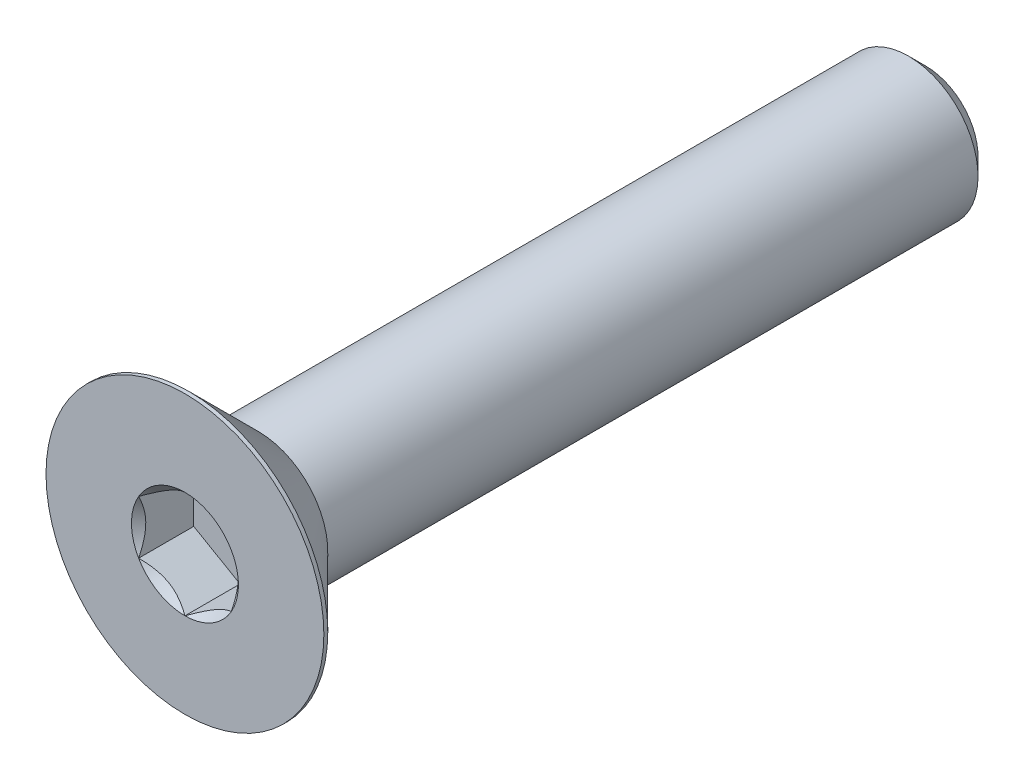
ISO-10303-21;
HEADER;
FILE_DESCRIPTION(('STEP AP214'),'2;1');
FILE_NAME('part.step','',(''),(''),'','','');
FILE_SCHEMA(('AUTOMOTIVE_DESIGN { 1 0 10303 214 1 1 1 1 }'));
ENDSEC;
DATA;
#1=APPLICATION_CONTEXT('core data for automotive mechanical design processes');
#2=APPLICATION_PROTOCOL_DEFINITION('international standard','automotive_design',2000,#1);
#3=PRODUCT_CONTEXT('',#1,'mechanical');
#4=PRODUCT('Part','Part','',(#3));
#5=PRODUCT_RELATED_PRODUCT_CATEGORY('part','',(#4));
#6=PRODUCT_DEFINITION_FORMATION('','',#4);
#7=PRODUCT_DEFINITION_CONTEXT('part definition',#1,'design');
#8=PRODUCT_DEFINITION('design','',#6,#7);
#9=PRODUCT_DEFINITION_SHAPE('','',#8);
#10=(LENGTH_UNIT() NAMED_UNIT(*) SI_UNIT(.MILLI.,.METRE.));
#11=(NAMED_UNIT(*) PLANE_ANGLE_UNIT() SI_UNIT($,.RADIAN.));
#12=(NAMED_UNIT(*) SI_UNIT($,.STERADIAN.) SOLID_ANGLE_UNIT());
#13=UNCERTAINTY_MEASURE_WITH_UNIT(LENGTH_MEASURE(1.E-05),#10,'distance_accuracy_value','');
#14=(GEOMETRIC_REPRESENTATION_CONTEXT(3) GLOBAL_UNCERTAINTY_ASSIGNED_CONTEXT((#13)) GLOBAL_UNIT_ASSIGNED_CONTEXT((#10,
#11,#12)) REPRESENTATION_CONTEXT('',''));
#15=CARTESIAN_POINT('',(0.,0.,0.));
#16=DIRECTION('',(0.,0.,1.));
#17=DIRECTION('',(1.,0.,0.));
#18=AXIS2_PLACEMENT_3D('',#15,#16,#17);
#19=CARTESIAN_POINT('',(0.,-1.5,-8.));
#20=DIRECTION('',(0.,0.,1.));
#21=DIRECTION('',(0.,-1.,0.));
#22=AXIS2_PLACEMENT_3D('',#19,#20,#21);
#23=PLANE('',#22);
#24=CARTESIAN_POINT('',(0.,0.,-8.));
#25=DIRECTION('',(0.,0.,-1.));
#26=DIRECTION('',(0.,-1.,0.));
#27=AXIS2_PLACEMENT_3D('',#24,#25,#26);
#28=CIRCLE('',#27,1.125);
#29=CARTESIAN_POINT('',(0.,1.125,-8.));
#30=VERTEX_POINT('',#29);
#31=EDGE_CURVE('E25',#30,#30,#28,.T.);
#32=ORIENTED_EDGE('',*,*,#31,.T.);
#33=EDGE_LOOP('',(#32));
#34=FACE_BOUND('',#33,.T.);
#35=ADVANCED_FACE('F17',(#34),#23,.F.);
#36=CARTESIAN_POINT('',(0.,-1.5,6.81));
#37=DIRECTION('',(0.,0.,-1.));
#38=DIRECTION('',(0.,-1.,0.));
#39=AXIS2_PLACEMENT_3D('',#36,#37,#38);
#40=PLANE('',#39);
#41=DIRECTION('',(0.,1.,0.));
#42=VECTOR('',#41,1.);
#43=CARTESIAN_POINT('',(1.,-1.03867513459482,6.81));
#44=LINE('',#43,#42);
#45=CARTESIAN_POINT('',(1.,-0.577350269189623,6.81));
#46=VERTEX_POINT('',#45);
#47=CARTESIAN_POINT('',(1.,0.577350269189626,6.81));
#48=VERTEX_POINT('',#47);
#49=EDGE_CURVE('E350',#46,#48,#44,.T.);
#50=ORIENTED_EDGE('',*,*,#49,.T.);
#51=DIRECTION('',(-0.866025403784439,0.5,0.));
#52=VECTOR('',#51,1.);
#53=CARTESIAN_POINT('',(1.07475952641917,0.534187836487029,6.81));
#54=LINE('',#53,#52);
#55=CARTESIAN_POINT('',(0.,1.15470053837925,6.81));
#56=VERTEX_POINT('',#55);
#57=EDGE_CURVE('E357',#48,#56,#54,.T.);
#58=ORIENTED_EDGE('',*,*,#57,.T.);
#59=DIRECTION('',(-0.866025403784439,-0.5,0.));
#60=VECTOR('',#59,1.);
#61=CARTESIAN_POINT('',(-0.574759526419163,0.822862971081845,6.81));
#62=LINE('',#61,#60);
#63=CARTESIAN_POINT('',(-1.,0.577350269189626,6.81));
#64=VERTEX_POINT('',#63);
#65=EDGE_CURVE('E118',#56,#64,#62,.T.);
#66=ORIENTED_EDGE('',*,*,#65,.T.);
#67=DIRECTION('',(0.,-1.,0.));
#68=VECTOR('',#67,1.);
#69=CARTESIAN_POINT('',(-1.,-0.461324865405193,6.81));
#70=LINE('',#69,#68);
#71=CARTESIAN_POINT('',(-1.,-0.577350269189624,6.81));
#72=VERTEX_POINT('',#71);
#73=EDGE_CURVE('E114',#64,#72,#70,.T.);
#74=ORIENTED_EDGE('',*,*,#73,.T.);
#75=DIRECTION('',(0.866025403784439,-0.5,0.));
#76=VECTOR('',#75,1.);
#77=CARTESIAN_POINT('',(-0.425240473580827,-0.909187836487034,6.81));
#78=LINE('',#77,#76);
#79=CARTESIAN_POINT('',(0.,-1.15470053837925,6.81));
#80=VERTEX_POINT('',#79);
#81=EDGE_CURVE('E101',#72,#80,#78,.T.);
#82=ORIENTED_EDGE('',*,*,#81,.T.);
#83=DIRECTION('',(0.866025403784439,0.5,0.));
#84=VECTOR('',#83,1.);
#85=CARTESIAN_POINT('',(-0.0747595264191642,-1.19786297108184,6.81));
#86=LINE('',#85,#84);
#87=EDGE_CURVE('E111',#80,#46,#86,.T.);
#88=ORIENTED_EDGE('',*,*,#87,.T.);
#89=EDGE_LOOP('',(#50,#58,#66,#74,#82,#88));
#90=FACE_BOUND('',#89,.T.);
#91=ADVANCED_FACE('F116',(#90),#40,.F.);
#92=CARTESIAN_POINT('',(0.,0.,6.81));
#93=DIRECTION('',(0.,0.,1.));
#94=DIRECTION('',(0.,-1.,0.));
#95=AXIS2_PLACEMENT_3D('',#92,#93,#94);
#96=CYLINDRICAL_SURFACE('',#95,1.5);
#97=CARTESIAN_POINT('',(0.,0.,6.415));
#98=DIRECTION('',(0.,0.,-1.));
#99=DIRECTION('',(0.,-1.,0.));
#100=AXIS2_PLACEMENT_3D('',#97,#98,#99);
#101=CIRCLE('',#100,1.5);
#102=CARTESIAN_POINT('',(0.,1.5,6.415));
#103=VERTEX_POINT('',#102);
#104=EDGE_CURVE('E335',#103,#103,#101,.T.);
#105=ORIENTED_EDGE('',*,*,#104,.T.);
#106=DIRECTION('',(0.,0.,-1.));
#107=VECTOR('',#106,1.);
#108=CARTESIAN_POINT('',(0.,1.5,6.81));
#109=LINE('',#108,#107);
#110=CARTESIAN_POINT('',(0.,1.5,-7.625));
#111=VERTEX_POINT('',#110);
#112=EDGE_CURVE('E11',#103,#111,#109,.T.);
#113=ORIENTED_EDGE('',*,*,#112,.T.);
#114=CARTESIAN_POINT('',(0.,0.,-7.625));
#115=DIRECTION('',(0.,0.,1.));
#116=DIRECTION('',(0.,-1.,0.));
#117=AXIS2_PLACEMENT_3D('',#114,#115,#116);
#118=CIRCLE('',#117,1.5);
#119=EDGE_CURVE('E139',#111,#111,#118,.T.);
#120=ORIENTED_EDGE('',*,*,#119,.T.);
#121=ORIENTED_EDGE('',*,*,#112,.F.);
#122=EDGE_LOOP('',(#105,#113,#120,#121));
#123=FACE_BOUND('',#122,.T.);
#124=ADVANCED_FACE('F213',(#123),#96,.T.);
#125=CARTESIAN_POINT('',(0.,0.,-7.625));
#126=DIRECTION('',(0.,0.,1.));
#127=DIRECTION('',(0.,-1.,0.));
#128=AXIS2_PLACEMENT_3D('',#125,#126,#127);
#129=CONICAL_SURFACE('',#128,1.5,0.785398163397452);
#130=ORIENTED_EDGE('',*,*,#119,.F.);
#131=DIRECTION('',(0.,-0.70710678118655,-0.707106781186545));
#132=VECTOR('',#131,1.);
#133=CARTESIAN_POINT('',(0.,1.5,-7.625));
#134=LINE('',#133,#132);
#135=EDGE_CURVE('E140',#111,#30,#134,.T.);
#136=ORIENTED_EDGE('',*,*,#135,.T.);
#137=ORIENTED_EDGE('',*,*,#31,.F.);
#138=ORIENTED_EDGE('',*,*,#135,.F.);
#139=EDGE_LOOP('',(#130,#136,#137,#138));
#140=FACE_BOUND('',#139,.T.);
#141=ADVANCED_FACE('F192',(#140),#129,.T.);
#142=CARTESIAN_POINT('',(0.,-1.15470053837925,6.81));
#143=DIRECTION('',(0.5,-0.866025403784439,0.));
#144=DIRECTION('',(0.,0.,-1.));
#145=AXIS2_PLACEMENT_3D('',#142,#143,#144);
#146=PLANE('',#145);
#147=CARTESIAN_POINT('',(0.999999999999948,-0.577350269189652,7.99999999999997));
#148=CARTESIAN_POINT('',(0.499999999999998,-0.866025403784436,7.71132486540521));
#149=CARTESIAN_POINT('',(0.,-1.15470053837922,7.99999999999997));
#150=(BOUNDED_CURVE() B_SPLINE_CURVE(2,(#147,#148,#149),.UNSPECIFIED.,.F.,
.F.) B_SPLINE_CURVE_WITH_KNOTS((3,3),(0.124274873543865,0.3218671551163),
.UNSPECIFIED.) CURVE() GEOMETRIC_REPRESENTATION_ITEM() RATIONAL_B_SPLINE_CURVE((1.46410161513778,
1.69059892324149,1.46410161513778)) REPRESENTATION_ITEM(''));
#151=CARTESIAN_POINT('',(1.,-0.577350269189624,8.));
#152=VERTEX_POINT('',#151);
#153=CARTESIAN_POINT('',(0.,-1.15470053837925,8.));
#154=VERTEX_POINT('',#153);
#155=EDGE_CURVE('E344',#152,#154,#150,.T.);
#156=ORIENTED_EDGE('',*,*,#155,.F.);
#157=DIRECTION('',(0.,0.,1.));
#158=VECTOR('',#157,1.);
#159=CARTESIAN_POINT('',(1.,-0.577350269189623,6.81));
#160=LINE('',#159,#158);
#161=EDGE_CURVE('E353',#46,#152,#160,.T.);
#162=ORIENTED_EDGE('',*,*,#161,.F.);
#163=ORIENTED_EDGE('',*,*,#87,.F.);
#164=DIRECTION('',(0.,0.,1.));
#165=VECTOR('',#164,1.);
#166=CARTESIAN_POINT('',(0.,-1.15470053837925,6.81));
#167=LINE('',#166,#165);
#168=EDGE_CURVE('E108',#80,#154,#167,.T.);
#169=ORIENTED_EDGE('',*,*,#168,.T.);
#170=EDGE_LOOP('',(#156,#162,#163,#169));
#171=FACE_BOUND('',#170,.T.);
#172=ADVANCED_FACE('F187',(#171),#146,.F.);
#173=CARTESIAN_POINT('',(-1.,-0.577350269189624,6.81));
#174=DIRECTION('',(-0.5,-0.866025403784439,0.));
#175=DIRECTION('',(-0.866025403784439,0.5,0.));
#176=AXIS2_PLACEMENT_3D('',#173,#174,#175);
#177=PLANE('',#176);
#178=CARTESIAN_POINT('',(0.,-1.15470053837922,7.99999999999997));
#179=CARTESIAN_POINT('',(-0.499999999999999,-0.866025403784436,7.71132486540521));
#180=CARTESIAN_POINT('',(-0.999999999999948,-0.577350269189652,7.99999999999997));
#181=(BOUNDED_CURVE() B_SPLINE_CURVE(2,(#178,#179,#180),.UNSPECIFIED.,.F.,
.F.) B_SPLINE_CURVE_WITH_KNOTS((3,3),(0.124274873543865,0.321867155116299),
.UNSPECIFIED.) CURVE() GEOMETRIC_REPRESENTATION_ITEM() RATIONAL_B_SPLINE_CURVE((1.46410161513778,
1.69059892324148,1.46410161513777)) REPRESENTATION_ITEM(''));
#182=CARTESIAN_POINT('',(-1.,-0.577350269189624,8.));
#183=VERTEX_POINT('',#182);
#184=EDGE_CURVE('E404',#154,#183,#181,.T.);
#185=ORIENTED_EDGE('',*,*,#184,.F.);
#186=ORIENTED_EDGE('',*,*,#168,.F.);
#187=ORIENTED_EDGE('',*,*,#81,.F.);
#188=DIRECTION('',(0.,0.,1.));
#189=VECTOR('',#188,1.);
#190=CARTESIAN_POINT('',(-1.,-0.577350269189624,6.81));
#191=LINE('',#190,#189);
#192=EDGE_CURVE('E106',#72,#183,#191,.T.);
#193=ORIENTED_EDGE('',*,*,#192,.T.);
#194=EDGE_LOOP('',(#185,#186,#187,#193));
#195=FACE_BOUND('',#194,.T.);
#196=ADVANCED_FACE('F104',(#195),#177,.F.);
#197=CARTESIAN_POINT('',(-1.,0.577350269189626,6.81));
#198=DIRECTION('',(-1.,0.,0.));
#199=DIRECTION('',(0.,0.,1.));
#200=AXIS2_PLACEMENT_3D('',#197,#198,#199);
#201=PLANE('',#200);
#202=CARTESIAN_POINT('',(-0.999999999999997,-0.577350269189565,7.99999999999997));
#203=CARTESIAN_POINT('',(-0.999999999999997,0.,7.71132486540521));
#204=CARTESIAN_POINT('',(-0.999999999999997,0.577350269189568,7.99999999999997));
#205=(BOUNDED_CURVE() B_SPLINE_CURVE(2,(#202,#203,#204),.UNSPECIFIED.,.F.,
.F.) B_SPLINE_CURVE_WITH_KNOTS((3,3),(0.124274873543866,0.321867155116299),
.UNSPECIFIED.) CURVE() GEOMETRIC_REPRESENTATION_ITEM() RATIONAL_B_SPLINE_CURVE((1.46410161513778,
1.69059892324148,1.46410161513778)) REPRESENTATION_ITEM(''));
#206=CARTESIAN_POINT('',(-1.,0.577350269189626,8.));
#207=VERTEX_POINT('',#206);
#208=EDGE_CURVE('E126',#183,#207,#205,.T.);
#209=ORIENTED_EDGE('',*,*,#208,.F.);
#210=ORIENTED_EDGE('',*,*,#192,.F.);
#211=ORIENTED_EDGE('',*,*,#73,.F.);
#212=DIRECTION('',(0.,0.,1.));
#213=VECTOR('',#212,1.);
#214=CARTESIAN_POINT('',(-1.,0.577350269189626,6.81));
#215=LINE('',#214,#213);
#216=EDGE_CURVE('E131',#64,#207,#215,.T.);
#217=ORIENTED_EDGE('',*,*,#216,.T.);
#218=EDGE_LOOP('',(#209,#210,#211,#217));
#219=FACE_BOUND('',#218,.T.);
#220=ADVANCED_FACE('F124',(#219),#201,.F.);
#221=CARTESIAN_POINT('',(0.,1.15470053837925,6.81));
#222=DIRECTION('',(-0.5,0.866025403784439,0.));
#223=DIRECTION('',(0.,0.,1.));
#224=AXIS2_PLACEMENT_3D('',#221,#222,#223);
#225=PLANE('',#224);
#226=CARTESIAN_POINT('',(-0.999999999999948,0.577350269189654,7.99999999999997));
#227=CARTESIAN_POINT('',(-0.499999999999999,0.866025403784439,7.71132486540521));
#228=CARTESIAN_POINT('',(0.,1.15470053837922,7.99999999999997));
#229=(BOUNDED_CURVE() B_SPLINE_CURVE(2,(#226,#227,#228),.UNSPECIFIED.,.F.,
.F.) B_SPLINE_CURVE_WITH_KNOTS((3,3),(0.124274873543865,0.321867155116299),
.UNSPECIFIED.) CURVE() GEOMETRIC_REPRESENTATION_ITEM() RATIONAL_B_SPLINE_CURVE((1.46410161513778,
1.69059892324148,1.46410161513778)) REPRESENTATION_ITEM(''));
#230=CARTESIAN_POINT('',(0.,1.15470053837925,8.));
#231=VERTEX_POINT('',#230);
#232=EDGE_CURVE('E396',#207,#231,#229,.T.);
#233=ORIENTED_EDGE('',*,*,#232,.F.);
#234=ORIENTED_EDGE('',*,*,#216,.F.);
#235=ORIENTED_EDGE('',*,*,#65,.F.);
#236=DIRECTION('',(0.,0.,1.));
#237=VECTOR('',#236,1.);
#238=CARTESIAN_POINT('',(0.,1.15470053837925,6.81));
#239=LINE('',#238,#237);
#240=EDGE_CURVE('E355',#56,#231,#239,.T.);
#241=ORIENTED_EDGE('',*,*,#240,.T.);
#242=EDGE_LOOP('',(#233,#234,#235,#241));
#243=FACE_BOUND('',#242,.T.);
#244=ADVANCED_FACE('F156',(#243),#225,.F.);
#245=CARTESIAN_POINT('',(1.,0.577350269189626,6.81));
#246=DIRECTION('',(0.5,0.866025403784439,0.));
#247=DIRECTION('',(0.,0.,-1.));
#248=AXIS2_PLACEMENT_3D('',#245,#246,#247);
#249=PLANE('',#248);
#250=CARTESIAN_POINT('',(0.,1.15470053837922,7.99999999999997));
#251=CARTESIAN_POINT('',(0.499999999999998,0.866025403784439,7.71132486540521));
#252=CARTESIAN_POINT('',(0.999999999999944,0.577350269189658,7.99999999999997));
#253=(BOUNDED_CURVE() B_SPLINE_CURVE(2,(#250,#251,#252),.UNSPECIFIED.,.F.,
.F.) B_SPLINE_CURVE_WITH_KNOTS((3,3),(0.124274873543865,0.321867155116298),
.UNSPECIFIED.) CURVE() GEOMETRIC_REPRESENTATION_ITEM() RATIONAL_B_SPLINE_CURVE((1.46410161513778,
1.69059892324148,1.46410161513778)) REPRESENTATION_ITEM(''));
#254=CARTESIAN_POINT('',(1.,0.577350269189626,8.));
#255=VERTEX_POINT('',#254);
#256=EDGE_CURVE('E386',#231,#255,#253,.T.);
#257=ORIENTED_EDGE('',*,*,#256,.F.);
#258=ORIENTED_EDGE('',*,*,#240,.F.);
#259=ORIENTED_EDGE('',*,*,#57,.F.);
#260=DIRECTION('',(0.,0.,1.));
#261=VECTOR('',#260,1.);
#262=CARTESIAN_POINT('',(1.,0.577350269189626,6.81));
#263=LINE('',#262,#261);
#264=EDGE_CURVE('E348',#48,#255,#263,.T.);
#265=ORIENTED_EDGE('',*,*,#264,.T.);
#266=EDGE_LOOP('',(#257,#258,#259,#265));
#267=FACE_BOUND('',#266,.T.);
#268=ADVANCED_FACE('F150',(#267),#249,.F.);
#269=CARTESIAN_POINT('',(1.,-0.577350269189623,6.81));
#270=DIRECTION('',(1.,0.,0.));
#271=DIRECTION('',(0.,-1.,0.));
#272=AXIS2_PLACEMENT_3D('',#269,#270,#271);
#273=PLANE('',#272);
#274=CARTESIAN_POINT('',(1.,0.577350269189568,7.99999999999997));
#275=CARTESIAN_POINT('',(1.,0.,7.71132486540521));
#276=CARTESIAN_POINT('',(1.,-0.577350269189565,7.99999999999997));
#277=(BOUNDED_CURVE() B_SPLINE_CURVE(2,(#274,#275,#276),.UNSPECIFIED.,.F.,
.F.) B_SPLINE_CURVE_WITH_KNOTS((3,3),(0.124274873543865,0.321867155116299),
.UNSPECIFIED.) CURVE() GEOMETRIC_REPRESENTATION_ITEM() RATIONAL_B_SPLINE_CURVE((1.46410161513777,
1.69059892324148,1.46410161513778)) REPRESENTATION_ITEM(''));
#278=EDGE_CURVE('E380',#255,#152,#277,.T.);
#279=ORIENTED_EDGE('',*,*,#278,.F.);
#280=ORIENTED_EDGE('',*,*,#264,.F.);
#281=ORIENTED_EDGE('',*,*,#49,.F.);
#282=ORIENTED_EDGE('',*,*,#161,.T.);
#283=EDGE_LOOP('',(#279,#280,#281,#282));
#284=FACE_BOUND('',#283,.T.);
#285=ADVANCED_FACE('F155',(#284),#273,.F.);
#286=CARTESIAN_POINT('',(0.,0.,8.));
#287=DIRECTION('',(0.,0.,1.));
#288=DIRECTION('',(-1.,0.,0.));
#289=AXIS2_PLACEMENT_3D('',#286,#287,#288);
#290=CONICAL_SURFACE('',#289,1.15470053837925,0.78539816339745);
#291=ORIENTED_EDGE('',*,*,#155,.T.);
#292=CARTESIAN_POINT('',(0.,0.,8.));
#293=DIRECTION('',(0.,0.,-1.));
#294=DIRECTION('',(-1.,0.,0.));
#295=AXIS2_PLACEMENT_3D('',#292,#293,#294);
#296=CIRCLE('',#295,1.15470053837925);
#297=EDGE_CURVE('E422',#152,#154,#296,.T.);
#298=ORIENTED_EDGE('',*,*,#297,.F.);
#299=EDGE_LOOP('',(#291,#298));
#300=FACE_BOUND('',#299,.T.);
#301=ADVANCED_FACE('F236',(#300),#290,.F.);
#302=CARTESIAN_POINT('',(0.,0.,8.));
#303=DIRECTION('',(0.,0.,1.));
#304=DIRECTION('',(-1.,0.,0.));
#305=AXIS2_PLACEMENT_3D('',#302,#303,#304);
#306=CONICAL_SURFACE('',#305,1.15470053837925,0.78539816339745);
#307=ORIENTED_EDGE('',*,*,#184,.T.);
#308=CARTESIAN_POINT('',(0.,0.,8.));
#309=DIRECTION('',(0.,0.,-1.));
#310=DIRECTION('',(-1.,0.,0.));
#311=AXIS2_PLACEMENT_3D('',#308,#309,#310);
#312=CIRCLE('',#311,1.15470053837925);
#313=EDGE_CURVE('E387',#154,#183,#312,.T.);
#314=ORIENTED_EDGE('',*,*,#313,.F.);
#315=EDGE_LOOP('',(#307,#314));
#316=FACE_BOUND('',#315,.T.);
#317=ADVANCED_FACE('F230',(#316),#306,.F.);
#318=CARTESIAN_POINT('',(0.,0.,8.));
#319=DIRECTION('',(0.,0.,1.));
#320=DIRECTION('',(-1.,0.,0.));
#321=AXIS2_PLACEMENT_3D('',#318,#319,#320);
#322=CONICAL_SURFACE('',#321,1.15470053837925,0.78539816339745);
#323=ORIENTED_EDGE('',*,*,#232,.T.);
#324=CARTESIAN_POINT('',(0.,0.,8.));
#325=DIRECTION('',(0.,0.,-1.));
#326=DIRECTION('',(-1.,0.,0.));
#327=AXIS2_PLACEMENT_3D('',#324,#325,#326);
#328=CIRCLE('',#327,1.15470053837925);
#329=EDGE_CURVE('E374',#207,#231,#328,.T.);
#330=ORIENTED_EDGE('',*,*,#329,.F.);
#331=EDGE_LOOP('',(#323,#330));
#332=FACE_BOUND('',#331,.T.);
#333=ADVANCED_FACE('F235',(#332),#322,.F.);
#334=CARTESIAN_POINT('',(0.,0.,8.));
#335=DIRECTION('',(0.,0.,1.));
#336=DIRECTION('',(-1.,0.,0.));
#337=AXIS2_PLACEMENT_3D('',#334,#335,#336);
#338=CONICAL_SURFACE('',#337,1.15470053837925,0.78539816339745);
#339=ORIENTED_EDGE('',*,*,#256,.T.);
#340=CARTESIAN_POINT('',(0.,0.,8.));
#341=DIRECTION('',(0.,0.,-1.));
#342=DIRECTION('',(-1.,0.,0.));
#343=AXIS2_PLACEMENT_3D('',#340,#341,#342);
#344=CIRCLE('',#343,1.15470053837925);
#345=EDGE_CURVE('E375',#231,#255,#344,.T.);
#346=ORIENTED_EDGE('',*,*,#345,.F.);
#347=EDGE_LOOP('',(#339,#346));
#348=FACE_BOUND('',#347,.T.);
#349=ADVANCED_FACE('F247',(#348),#338,.F.);
#350=CARTESIAN_POINT('',(0.,0.,8.));
#351=DIRECTION('',(0.,0.,1.));
#352=DIRECTION('',(1.,0.,0.));
#353=AXIS2_PLACEMENT_3D('',#350,#351,#352);
#354=CONICAL_SURFACE('',#353,1.15470053837925,0.78539816339745);
#355=ORIENTED_EDGE('',*,*,#278,.T.);
#356=CARTESIAN_POINT('',(0.,0.,8.));
#357=DIRECTION('',(0.,0.,-1.));
#358=DIRECTION('',(-1.,0.,0.));
#359=AXIS2_PLACEMENT_3D('',#356,#357,#358);
#360=CIRCLE('',#359,1.15470053837925);
#361=EDGE_CURVE('E379',#255,#152,#360,.T.);
#362=ORIENTED_EDGE('',*,*,#361,.F.);
#363=EDGE_LOOP('',(#355,#362));
#364=FACE_BOUND('',#363,.T.);
#365=ADVANCED_FACE('F223',(#364),#354,.F.);
#366=CARTESIAN_POINT('',(0.,0.,8.));
#367=DIRECTION('',(0.,0.,-1.));
#368=DIRECTION('',(0.,-1.,0.));
#369=AXIS2_PLACEMENT_3D('',#366,#367,#368);
#370=PLANE('',#369);
#371=ORIENTED_EDGE('',*,*,#329,.T.);
#372=ORIENTED_EDGE('',*,*,#345,.T.);
#373=ORIENTED_EDGE('',*,*,#361,.T.);
#374=ORIENTED_EDGE('',*,*,#297,.T.);
#375=ORIENTED_EDGE('',*,*,#313,.T.);
#376=CARTESIAN_POINT('',(0.,0.,8.));
#377=DIRECTION('',(0.,0.,-1.));
#378=DIRECTION('',(-1.,0.,0.));
#379=AXIS2_PLACEMENT_3D('',#376,#377,#378);
#380=CIRCLE('',#379,1.15470053837925);
#381=EDGE_CURVE('E451',#183,#207,#380,.T.);
#382=ORIENTED_EDGE('',*,*,#381,.T.);
#383=EDGE_LOOP('',(#371,#372,#373,#374,#375,#382));
#384=FACE_BOUND('',#383,.T.);
#385=CARTESIAN_POINT('',(0.,0.,8.));
#386=DIRECTION('',(0.,0.,1.));
#387=DIRECTION('',(0.,-1.,0.));
#388=AXIS2_PLACEMENT_3D('',#385,#386,#387);
#389=CIRCLE('',#388,3.);
#390=CARTESIAN_POINT('',(0.,3.,8.));
#391=VERTEX_POINT('',#390);
#392=EDGE_CURVE('E370',#391,#391,#389,.T.);
#393=ORIENTED_EDGE('',*,*,#392,.T.);
#394=EDGE_LOOP('',(#393));
#395=FACE_BOUND('',#394,.T.);
#396=ADVANCED_FACE('F203',(#384,#395),#370,.F.);
#397=CARTESIAN_POINT('',(0.,0.,8.));
#398=DIRECTION('',(0.,0.,1.));
#399=DIRECTION('',(0.,-1.,0.));
#400=AXIS2_PLACEMENT_3D('',#397,#398,#399);
#401=CYLINDRICAL_SURFACE('',#400,3.);
#402=ORIENTED_EDGE('',*,*,#392,.F.);
#403=DIRECTION('',(0.,0.,-1.));
#404=VECTOR('',#403,1.);
#405=CARTESIAN_POINT('',(0.,3.,8.));
#406=LINE('',#405,#404);
#407=CARTESIAN_POINT('',(0.,3.,7.915));
#408=VERTEX_POINT('',#407);
#409=EDGE_CURVE('E372',#391,#408,#406,.T.);
#410=ORIENTED_EDGE('',*,*,#409,.T.);
#411=CARTESIAN_POINT('',(0.,0.,7.915));
#412=DIRECTION('',(0.,0.,1.));
#413=DIRECTION('',(0.,-1.,0.));
#414=AXIS2_PLACEMENT_3D('',#411,#412,#413);
#415=CIRCLE('',#414,3.);
#416=EDGE_CURVE('E441',#408,#408,#415,.T.);
#417=ORIENTED_EDGE('',*,*,#416,.T.);
#418=ORIENTED_EDGE('',*,*,#409,.F.);
#419=EDGE_LOOP('',(#402,#410,#417,#418));
#420=FACE_BOUND('',#419,.T.);
#421=ADVANCED_FACE('F171',(#420),#401,.T.);
#422=CARTESIAN_POINT('',(0.,0.,8.));
#423=DIRECTION('',(0.,0.,1.));
#424=DIRECTION('',(-1.,0.,0.));
#425=AXIS2_PLACEMENT_3D('',#422,#423,#424);
#426=CONICAL_SURFACE('',#425,1.15470053837925,0.78539816339745);
#427=ORIENTED_EDGE('',*,*,#208,.T.);
#428=ORIENTED_EDGE('',*,*,#381,.F.);
#429=EDGE_LOOP('',(#427,#428));
#430=FACE_BOUND('',#429,.T.);
#431=ADVANCED_FACE('F165',(#430),#426,.F.);
#432=CARTESIAN_POINT('',(0.,0.,7.915));
#433=DIRECTION('',(0.,0.,1.));
#434=DIRECTION('',(0.,-1.,0.));
#435=AXIS2_PLACEMENT_3D('',#432,#433,#434);
#436=CONICAL_SURFACE('',#435,3.,0.785398163397448);
#437=ORIENTED_EDGE('',*,*,#416,.F.);
#438=DIRECTION('',(0.,-0.707106781186547,-0.707106781186548));
#439=VECTOR('',#438,1.);
#440=CARTESIAN_POINT('',(0.,3.,7.915));
#441=LINE('',#440,#439);
#442=EDGE_CURVE('E442',#408,#103,#441,.T.);
#443=ORIENTED_EDGE('',*,*,#442,.T.);
#444=ORIENTED_EDGE('',*,*,#104,.F.);
#445=ORIENTED_EDGE('',*,*,#442,.F.);
#446=EDGE_LOOP('',(#437,#443,#444,#445));
#447=FACE_BOUND('',#446,.T.);
#448=ADVANCED_FACE('F170',(#447),#436,.T.);
#449=CLOSED_SHELL('',(#35,#91,#124,#141,#172,#196,#220,#244,#268,#285,#301,#317,#333,#349,#365,
#396,#421,#431,#448));
#450=MANIFOLD_SOLID_BREP('B1',#449);
#451=ADVANCED_BREP_SHAPE_REPRESENTATION('',(#18,#450),#14);
#452=SHAPE_DEFINITION_REPRESENTATION(#9,#451);
ENDSEC;
END-ISO-10303-21;
